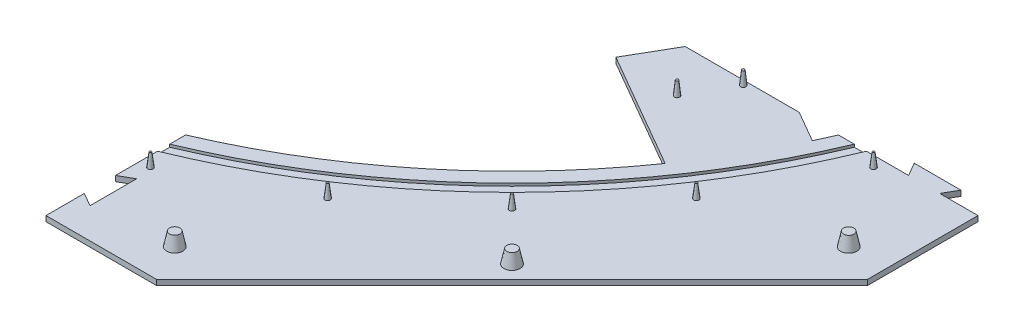
ISO-10303-21;
HEADER;
FILE_DESCRIPTION(('STEP AP214'),'2;1');
FILE_NAME('part.step','',(''),(''),'','','');
FILE_SCHEMA(('AUTOMOTIVE_DESIGN { 1 0 10303 214 1 1 1 1 }'));
ENDSEC;
DATA;
#1=APPLICATION_CONTEXT('core data for automotive mechanical design processes');
#2=APPLICATION_PROTOCOL_DEFINITION('international standard','automotive_design',2000,#1);
#3=PRODUCT_CONTEXT('',#1,'mechanical');
#4=PRODUCT('Part','Part','',(#3));
#5=PRODUCT_RELATED_PRODUCT_CATEGORY('part','',(#4));
#6=PRODUCT_DEFINITION_FORMATION('','',#4);
#7=PRODUCT_DEFINITION_CONTEXT('part definition',#1,'design');
#8=PRODUCT_DEFINITION('design','',#6,#7);
#9=PRODUCT_DEFINITION_SHAPE('','',#8);
#10=(LENGTH_UNIT() NAMED_UNIT(*) SI_UNIT(.MILLI.,.METRE.));
#11=(NAMED_UNIT(*) PLANE_ANGLE_UNIT() SI_UNIT($,.RADIAN.));
#12=(NAMED_UNIT(*) SI_UNIT($,.STERADIAN.) SOLID_ANGLE_UNIT());
#13=UNCERTAINTY_MEASURE_WITH_UNIT(LENGTH_MEASURE(1.E-05),#10,'distance_accuracy_value','');
#14=(GEOMETRIC_REPRESENTATION_CONTEXT(3) GLOBAL_UNCERTAINTY_ASSIGNED_CONTEXT((#13)) GLOBAL_UNIT_ASSIGNED_CONTEXT((#10,
#11,#12)) REPRESENTATION_CONTEXT('',''));
#15=CARTESIAN_POINT('',(0.,0.,0.));
#16=DIRECTION('',(0.,0.,1.));
#17=DIRECTION('',(1.,0.,0.));
#18=AXIS2_PLACEMENT_3D('',#15,#16,#17);
#19=CARTESIAN_POINT('',(0.,0.,0.));
#20=DIRECTION('',(0.,1.,0.));
#21=DIRECTION('',(0.,0.,1.));
#22=AXIS2_PLACEMENT_3D('',#19,#20,#21);
#23=PLANE('',#22);
#24=CARTESIAN_POINT('',(178.571106160672,0.,92.7057713659409));
#25=DIRECTION('',(0.,1.,0.));
#26=DIRECTION('',(-0.866025403784436,0.,-0.500000000000004));
#27=AXIS2_PLACEMENT_3D('',#24,#25,#26);
#28=CIRCLE('',#27,1.);
#29=CARTESIAN_POINT('',(177.705080756887,0.,92.2057713659409));
#30=VERTEX_POINT('',#29);
#31=EDGE_CURVE('E391',#30,#30,#28,.T.);
#32=ORIENTED_EDGE('',*,*,#31,.F.);
#33=EDGE_LOOP('',(#32));
#34=FACE_BOUND('',#33,.T.);
#35=CARTESIAN_POINT('',(169.571106160672,0.,108.294228634061));
#36=DIRECTION('',(0.,1.,0.));
#37=DIRECTION('',(-0.866025403784436,0.,-0.500000000000004));
#38=AXIS2_PLACEMENT_3D('',#35,#36,#37);
#39=CIRCLE('',#38,1.);
#40=CARTESIAN_POINT('',(168.705080756887,0.,107.794228634061));
#41=VERTEX_POINT('',#40);
#42=EDGE_CURVE('E399',#41,#41,#39,.T.);
#43=ORIENTED_EDGE('',*,*,#42,.F.);
#44=EDGE_LOOP('',(#43));
#45=FACE_BOUND('',#44,.T.);
#46=DIRECTION('',(0.,0.,1.));
#47=VECTOR('',#46,1.);
#48=CARTESIAN_POINT('',(91.0000000000001,0.,0.));
#49=LINE('',#48,#47);
#50=CARTESIAN_POINT('',(91.0000000000001,0.,212.176813059297));
#51=VERTEX_POINT('',#50);
#52=CARTESIAN_POINT('',(91.0000000000001,0.,218.074964175166));
#53=VERTEX_POINT('',#52);
#54=EDGE_CURVE('E312',#51,#53,#49,.T.);
#55=ORIENTED_EDGE('',*,*,#54,.T.);
#56=CARTESIAN_POINT('',(0.,0.,0.));
#57=DIRECTION('',(0.,1.,0.));
#58=DIRECTION('',(0.,0.,1.));
#59=AXIS2_PLACEMENT_3D('',#56,#57,#58);
#60=CIRCLE('',#59,236.3);
#61=CARTESIAN_POINT('',(218.074964175166,0.,91.));
#62=VERTEX_POINT('',#61);
#63=EDGE_CURVE('E194',#53,#62,#60,.T.);
#64=ORIENTED_EDGE('',*,*,#63,.T.);
#65=DIRECTION('',(-1.,0.,0.));
#66=VECTOR('',#65,1.);
#67=CARTESIAN_POINT('',(0.,0.,91.));
#68=LINE('',#67,#66);
#69=CARTESIAN_POINT('',(212.176813059297,0.,90.9999999999999));
#70=VERTEX_POINT('',#69);
#71=EDGE_CURVE('E298',#62,#70,#68,.T.);
#72=ORIENTED_EDGE('',*,*,#71,.T.);
#73=CARTESIAN_POINT('',(0.,0.,0.));
#74=DIRECTION('',(0.,1.,0.));
#75=DIRECTION('',(0.86602540378444,0.,0.499999999999998));
#76=AXIS2_PLACEMENT_3D('',#73,#74,#75);
#77=CIRCLE('',#76,230.867927612304);
#78=CARTESIAN_POINT('',(209.185842870421,0.,97.6794919243107));
#79=VERTEX_POINT('',#78);
#80=EDGE_CURVE('E326',#79,#70,#77,.T.);
#81=ORIENTED_EDGE('',*,*,#80,.F.);
#82=DIRECTION('',(-0.86602540378444,0.,-0.499999999999998));
#83=VECTOR('',#82,1.);
#84=CARTESIAN_POINT('',(9.99999999999994,0.,-17.3205080756888));
#85=LINE('',#84,#83);
#86=CARTESIAN_POINT('',(197.616623488769,0.,91.));
#87=VERTEX_POINT('',#86);
#88=EDGE_CURVE('E344',#79,#87,#85,.T.);
#89=ORIENTED_EDGE('',*,*,#88,.T.);
#90=CARTESIAN_POINT('',(155.307222412009,0.,91.));
#91=VERTEX_POINT('',#90);
#92=EDGE_CURVE('E293',#87,#91,#68,.T.);
#93=ORIENTED_EDGE('',*,*,#92,.T.);
#94=DIRECTION('',(-0.499999999999998,0.,0.86602540378444));
#95=VECTOR('',#94,1.);
#96=CARTESIAN_POINT('',(155.884572681199,0.,89.9999999999996));
#97=LINE('',#96,#95);
#98=CARTESIAN_POINT('',(145.884572681199,0.,107.320508075688));
#99=VERTEX_POINT('',#98);
#100=EDGE_CURVE('E341',#91,#99,#97,.T.);
#101=ORIENTED_EDGE('',*,*,#100,.T.);
#102=DIRECTION('',(-0.86602540378444,0.,-0.499999999999998));
#103=VECTOR('',#102,1.);
#104=CARTESIAN_POINT('',(-9.99999999999995,0.,17.3205080756888));
#105=LINE('',#104,#103);
#106=CARTESIAN_POINT('',(189.185842870421,0.,132.320508075688));
#107=VERTEX_POINT('',#106);
#108=EDGE_CURVE('E320',#107,#99,#105,.T.);
#109=ORIENTED_EDGE('',*,*,#108,.F.);
#110=CARTESIAN_POINT('',(0.,0.,0.));
#111=DIRECTION('',(0.,1.,0.));
#112=DIRECTION('',(0.,0.,1.));
#113=AXIS2_PLACEMENT_3D('',#110,#111,#112);
#114=CIRCLE('',#113,230.867927612304);
#115=EDGE_CURVE('E354',#51,#107,#114,.T.);
#116=ORIENTED_EDGE('',*,*,#115,.F.);
#117=EDGE_LOOP('',(#55,#64,#72,#81,#89,#93,#101,#109,#116));
#118=FACE_BOUND('',#117,.T.);
#119=ADVANCED_FACE('F38',(#34,#45,#118),#23,.T.);
#120=CARTESIAN_POINT('',(91.0000000000001,5.,91.));
#121=DIRECTION('',(0.,0.,-1.));
#122=DIRECTION('',(-1.,0.,0.));
#123=AXIS2_PLACEMENT_3D('',#120,#121,#122);
#124=PLANE('',#123);
#125=DIRECTION('',(0.,-1.,0.));
#126=VECTOR('',#125,1.);
#127=CARTESIAN_POINT('',(249.773502691896,5.,91.));
#128=LINE('',#127,#126);
#129=CARTESIAN_POINT('',(249.773502691896,0.,91.));
#130=VERTEX_POINT('',#129);
#131=CARTESIAN_POINT('',(249.773502691896,-2.,91.));
#132=VERTEX_POINT('',#131);
#133=EDGE_CURVE('E62',#130,#132,#128,.T.);
#134=ORIENTED_EDGE('',*,*,#133,.F.);
#135=CARTESIAN_POINT('',(264.,0.,91.));
#136=VERTEX_POINT('',#135);
#137=EDGE_CURVE('E299',#136,#130,#68,.T.);
#138=ORIENTED_EDGE('',*,*,#137,.F.);
#139=DIRECTION('',(0.,1.,0.));
#140=VECTOR('',#139,1.);
#141=CARTESIAN_POINT('',(264.,-2.,91.));
#142=LINE('',#141,#140);
#143=CARTESIAN_POINT('',(264.,-2.,91.));
#144=VERTEX_POINT('',#143);
#145=EDGE_CURVE('E307',#144,#136,#142,.T.);
#146=ORIENTED_EDGE('',*,*,#145,.F.);
#147=DIRECTION('',(1.,0.,0.));
#148=VECTOR('',#147,1.);
#149=CARTESIAN_POINT('',(91.0000000000001,-2.,91.));
#150=LINE('',#149,#148);
#151=EDGE_CURVE('E287',#132,#144,#150,.T.);
#152=ORIENTED_EDGE('',*,*,#151,.F.);
#153=EDGE_LOOP('',(#134,#138,#146,#152));
#154=FACE_BOUND('',#153,.T.);
#155=ADVANCED_FACE('F545',(#154),#124,.T.);
#156=CARTESIAN_POINT('',(91.,5.,290.));
#157=DIRECTION('',(-1.,0.,0.));
#158=DIRECTION('',(0.,0.,1.));
#159=AXIS2_PLACEMENT_3D('',#156,#157,#158);
#160=PLANE('',#159);
#161=DIRECTION('',(0.,1.,0.));
#162=VECTOR('',#161,1.);
#163=CARTESIAN_POINT('',(91.0000000000001,-1.,222.619069264068));
#164=LINE('',#163,#162);
#165=CARTESIAN_POINT('',(91.0000000000001,-1.,222.619069264068));
#166=VERTEX_POINT('',#165);
#167=CARTESIAN_POINT('',(91.0000000000001,0.,222.619069264068));
#168=VERTEX_POINT('',#167);
#169=EDGE_CURVE('E214',#166,#168,#164,.T.);
#170=ORIENTED_EDGE('',*,*,#169,.F.);
#171=DIRECTION('',(0.,0.,-1.));
#172=VECTOR('',#171,1.);
#173=CARTESIAN_POINT('',(91.,-1.,290.));
#174=LINE('',#173,#172);
#175=CARTESIAN_POINT('',(91.0000000000001,-1.,218.074964175166));
#176=VERTEX_POINT('',#175);
#177=EDGE_CURVE('E199',#166,#176,#174,.T.);
#178=ORIENTED_EDGE('',*,*,#177,.T.);
#179=DIRECTION('',(0.,1.,0.));
#180=VECTOR('',#179,1.);
#181=CARTESIAN_POINT('',(91.0000000000001,-1.,218.074964175166));
#182=LINE('',#181,#180);
#183=EDGE_CURVE('E191',#176,#53,#182,.T.);
#184=ORIENTED_EDGE('',*,*,#183,.T.);
#185=ORIENTED_EDGE('',*,*,#54,.F.);
#186=DIRECTION('',(0.,1.,0.));
#187=VECTOR('',#186,1.);
#188=CARTESIAN_POINT('',(91.0000000000001,-2.,212.176813059297));
#189=LINE('',#188,#187);
#190=CARTESIAN_POINT('',(91.0000000000001,-2.,212.176813059297));
#191=VERTEX_POINT('',#190);
#192=EDGE_CURVE('E480',#51,#191,#189,.F.);
#193=ORIENTED_EDGE('',*,*,#192,.T.);
#194=DIRECTION('',(0.,0.,-1.));
#195=VECTOR('',#194,1.);
#196=CARTESIAN_POINT('',(91.,-2.,290.));
#197=LINE('',#196,#195);
#198=CARTESIAN_POINT('',(91.0000000000001,-2.,238.226497308104));
#199=VERTEX_POINT('',#198);
#200=EDGE_CURVE('E279',#199,#191,#197,.T.);
#201=ORIENTED_EDGE('',*,*,#200,.F.);
#202=DIRECTION('',(0.,-1.,0.));
#203=VECTOR('',#202,1.);
#204=CARTESIAN_POINT('',(91.0000000000001,5.,238.226497308104));
#205=LINE('',#204,#203);
#206=CARTESIAN_POINT('',(91.0000000000001,0.,238.226497308104));
#207=VERTEX_POINT('',#206);
#208=EDGE_CURVE('E486',#207,#199,#205,.T.);
#209=ORIENTED_EDGE('',*,*,#208,.F.);
#210=EDGE_CURVE('E316',#168,#207,#49,.T.);
#211=ORIENTED_EDGE('',*,*,#210,.F.);
#212=EDGE_LOOP('',(#170,#178,#184,#185,#193,#201,#209,#211));
#213=FACE_BOUND('',#212,.T.);
#214=ADVANCED_FACE('F212',(#213),#160,.T.);
#215=CARTESIAN_POINT('',(0.,-2.,0.));
#216=DIRECTION('',(0.,1.,0.));
#217=DIRECTION('',(0.,0.,1.));
#218=AXIS2_PLACEMENT_3D('',#215,#216,#217);
#219=PLANE('',#218);
#220=DIRECTION('',(-0.500000000000001,0.,0.866025403784438));
#221=VECTOR('',#220,1.);
#222=CARTESIAN_POINT('',(252.660254037844,-2.,86.));
#223=LINE('',#222,#221);
#224=CARTESIAN_POINT('',(252.660254037844,-2.,86.));
#225=VERTEX_POINT('',#224);
#226=EDGE_CURVE('E224',#225,#132,#223,.T.);
#227=ORIENTED_EDGE('',*,*,#226,.T.);
#228=ORIENTED_EDGE('',*,*,#151,.T.);
#229=DIRECTION('',(0.,0.,-1.));
#230=VECTOR('',#229,1.);
#231=CARTESIAN_POINT('',(264.,-2.,131.979594929244));
#232=LINE('',#231,#230);
#233=CARTESIAN_POINT('',(264.,-2.,131.979594929244));
#234=VERTEX_POINT('',#233);
#235=EDGE_CURVE('E447',#234,#144,#232,.T.);
#236=ORIENTED_EDGE('',*,*,#235,.F.);
#237=DIRECTION('',(0.707105696396142,0.,-0.707107865975289));
#238=VECTOR('',#237,1.);
#239=CARTESIAN_POINT('',(264.,-2.,131.979594929244));
#240=LINE('',#239,#238);
#241=CARTESIAN_POINT('',(131.98,-2.,264.));
#242=VERTEX_POINT('',#241);
#243=EDGE_CURVE('E455',#242,#234,#240,.T.);
#244=ORIENTED_EDGE('',*,*,#243,.F.);
#245=DIRECTION('',(1.,0.,0.));
#246=VECTOR('',#245,1.);
#247=CARTESIAN_POINT('',(-131.979594929244,-2.,264.));
#248=LINE('',#247,#246);
#249=CARTESIAN_POINT('',(91.,-2.,264.));
#250=VERTEX_POINT('',#249);
#251=EDGE_CURVE('E451',#250,#242,#248,.T.);
#252=ORIENTED_EDGE('',*,*,#251,.F.);
#253=CARTESIAN_POINT('',(91.,-2.,249.773502691896));
#254=VERTEX_POINT('',#253);
#255=EDGE_CURVE('E283',#250,#254,#197,.T.);
#256=ORIENTED_EDGE('',*,*,#255,.T.);
#257=DIRECTION('',(0.866025403784439,0.,0.5));
#258=VECTOR('',#257,1.);
#259=CARTESIAN_POINT('',(81.0000000000001,-2.,244.));
#260=LINE('',#259,#258);
#261=CARTESIAN_POINT('',(96.,-2.,252.660254037844));
#262=VERTEX_POINT('',#261);
#263=EDGE_CURVE('E257',#254,#262,#260,.T.);
#264=ORIENTED_EDGE('',*,*,#263,.T.);
#265=DIRECTION('',(0.,0.,-1.));
#266=VECTOR('',#265,1.);
#267=CARTESIAN_POINT('',(96.,-2.,252.660254037844));
#268=LINE('',#267,#266);
#269=CARTESIAN_POINT('',(96.,-2.,235.339745962156));
#270=VERTEX_POINT('',#269);
#271=EDGE_CURVE('E262',#262,#270,#268,.T.);
#272=ORIENTED_EDGE('',*,*,#271,.T.);
#273=DIRECTION('',(-0.866025403784439,0.,0.5));
#274=VECTOR('',#273,1.);
#275=CARTESIAN_POINT('',(96.,-2.,235.339745962156));
#276=LINE('',#275,#274);
#277=EDGE_CURVE('E253',#270,#199,#276,.T.);
#278=ORIENTED_EDGE('',*,*,#277,.T.);
#279=ORIENTED_EDGE('',*,*,#200,.T.);
#280=CARTESIAN_POINT('',(0.,-2.,0.));
#281=DIRECTION('',(0.,1.,0.));
#282=DIRECTION('',(0.,0.,1.));
#283=AXIS2_PLACEMENT_3D('',#280,#281,#282);
#284=CIRCLE('',#283,230.867927612304);
#285=CARTESIAN_POINT('',(189.185842870421,-2.,132.320508075688));
#286=VERTEX_POINT('',#285);
#287=EDGE_CURVE('E362',#191,#286,#284,.T.);
#288=ORIENTED_EDGE('',*,*,#287,.T.);
#289=DIRECTION('',(-0.86602540378444,0.,-0.499999999999998));
#290=VECTOR('',#289,1.);
#291=CARTESIAN_POINT('',(-9.99999999999995,-2.,17.3205080756888));
#292=LINE('',#291,#290);
#293=CARTESIAN_POINT('',(145.884572681199,-2.,107.320508075688));
#294=VERTEX_POINT('',#293);
#295=EDGE_CURVE('E321',#286,#294,#292,.T.);
#296=ORIENTED_EDGE('',*,*,#295,.T.);
#297=DIRECTION('',(-0.499999999999998,0.,0.86602540378444));
#298=VECTOR('',#297,1.);
#299=CARTESIAN_POINT('',(155.884572681199,-2.,89.9999999999996));
#300=LINE('',#299,#298);
#301=CARTESIAN_POINT('',(155.307222412009,-2.,91.));
#302=VERTEX_POINT('',#301);
#303=EDGE_CURVE('E325',#302,#294,#300,.T.);
#304=ORIENTED_EDGE('',*,*,#303,.F.);
#305=CARTESIAN_POINT('',(197.616623488769,-2.,91.));
#306=VERTEX_POINT('',#305);
#307=EDGE_CURVE('E292',#302,#306,#150,.T.);
#308=ORIENTED_EDGE('',*,*,#307,.T.);
#309=DIRECTION('',(-0.86602540378444,0.,-0.499999999999998));
#310=VECTOR('',#309,1.);
#311=CARTESIAN_POINT('',(9.99999999999994,-2.,-17.3205080756888));
#312=LINE('',#311,#310);
#313=CARTESIAN_POINT('',(209.185842870421,-2.,97.6794919243107));
#314=VERTEX_POINT('',#313);
#315=EDGE_CURVE('E329',#314,#306,#312,.T.);
#316=ORIENTED_EDGE('',*,*,#315,.F.);
#317=CARTESIAN_POINT('',(0.,-2.,0.));
#318=DIRECTION('',(0.,1.,0.));
#319=DIRECTION('',(0.86602540378444,0.,0.499999999999998));
#320=AXIS2_PLACEMENT_3D('',#317,#318,#319);
#321=CIRCLE('',#320,230.867927612304);
#322=CARTESIAN_POINT('',(212.176813059297,-2.,91.));
#323=VERTEX_POINT('',#322);
#324=EDGE_CURVE('E333',#314,#323,#321,.T.);
#325=ORIENTED_EDGE('',*,*,#324,.T.);
#326=CARTESIAN_POINT('',(238.226497308104,-2.,91.));
#327=VERTEX_POINT('',#326);
#328=EDGE_CURVE('E288',#323,#327,#150,.T.);
#329=ORIENTED_EDGE('',*,*,#328,.T.);
#330=DIRECTION('',(-0.5,0.,-0.866025403784439));
#331=VECTOR('',#330,1.);
#332=CARTESIAN_POINT('',(244.,-2.,101.));
#333=LINE('',#332,#331);
#334=CARTESIAN_POINT('',(235.339745962156,-2.,86.));
#335=VERTEX_POINT('',#334);
#336=EDGE_CURVE('E220',#327,#335,#333,.T.);
#337=ORIENTED_EDGE('',*,*,#336,.T.);
#338=DIRECTION('',(1.,0.,0.));
#339=VECTOR('',#338,1.);
#340=CARTESIAN_POINT('',(235.339745962156,-2.,86.));
#341=LINE('',#340,#339);
#342=EDGE_CURVE('E229',#335,#225,#341,.T.);
#343=ORIENTED_EDGE('',*,*,#342,.T.);
#344=EDGE_LOOP('',(#227,#228,#236,#244,#252,#256,#264,#272,#278,#279,#288,#296,#304,#308,#316,
#325,#329,#337,#343));
#345=FACE_BOUND('',#344,.T.);
#346=ADVANCED_FACE('F553',(#345),#219,.F.);
#347=CARTESIAN_POINT('',(0.,0.,0.));
#348=DIRECTION('',(0.,1.,0.));
#349=DIRECTION('',(0.,0.,1.));
#350=AXIS2_PLACEMENT_3D('',#347,#348,#349);
#351=CIRCLE('',#350,240.5);
#352=CARTESIAN_POINT('',(222.619069264068,0.,91.));
#353=VERTEX_POINT('',#352);
#354=EDGE_CURVE('E209',#168,#353,#351,.T.);
#355=ORIENTED_EDGE('',*,*,#354,.F.);
#356=ORIENTED_EDGE('',*,*,#210,.T.);
#357=DIRECTION('',(-0.866025403784439,0.,0.5));
#358=VECTOR('',#357,1.);
#359=CARTESIAN_POINT('',(96.,0.,235.339745962156));
#360=LINE('',#359,#358);
#361=CARTESIAN_POINT('',(96.,0.,235.339745962156));
#362=VERTEX_POINT('',#361);
#363=EDGE_CURVE('E252',#362,#207,#360,.T.);
#364=ORIENTED_EDGE('',*,*,#363,.F.);
#365=DIRECTION('',(0.,0.,-1.));
#366=VECTOR('',#365,1.);
#367=CARTESIAN_POINT('',(96.,0.,252.660254037844));
#368=LINE('',#367,#366);
#369=CARTESIAN_POINT('',(96.,0.,252.660254037844));
#370=VERTEX_POINT('',#369);
#371=EDGE_CURVE('E258',#370,#362,#368,.T.);
#372=ORIENTED_EDGE('',*,*,#371,.F.);
#373=DIRECTION('',(0.866025403784439,0.,0.5));
#374=VECTOR('',#373,1.);
#375=CARTESIAN_POINT('',(81.0000000000001,0.,244.));
#376=LINE('',#375,#374);
#377=CARTESIAN_POINT('',(91.,0.,249.773502691896));
#378=VERTEX_POINT('',#377);
#379=EDGE_CURVE('E270',#378,#370,#376,.T.);
#380=ORIENTED_EDGE('',*,*,#379,.F.);
#381=CARTESIAN_POINT('',(91.,0.,264.));
#382=VERTEX_POINT('',#381);
#383=EDGE_CURVE('E311',#378,#382,#49,.T.);
#384=ORIENTED_EDGE('',*,*,#383,.T.);
#385=DIRECTION('',(1.,0.,0.));
#386=VECTOR('',#385,1.);
#387=CARTESIAN_POINT('',(0.,0.,264.));
#388=LINE('',#387,#386);
#389=CARTESIAN_POINT('',(131.98,0.,264.));
#390=VERTEX_POINT('',#389);
#391=EDGE_CURVE('E463',#382,#390,#388,.T.);
#392=ORIENTED_EDGE('',*,*,#391,.T.);
#393=DIRECTION('',(0.707105696396142,0.,-0.707107865975289));
#394=VECTOR('',#393,1.);
#395=CARTESIAN_POINT('',(264.,0.,131.979594929244));
#396=LINE('',#395,#394);
#397=CARTESIAN_POINT('',(264.,0.,131.979594929244));
#398=VERTEX_POINT('',#397);
#399=EDGE_CURVE('E452',#390,#398,#396,.T.);
#400=ORIENTED_EDGE('',*,*,#399,.T.);
#401=DIRECTION('',(0.,0.,-1.));
#402=VECTOR('',#401,1.);
#403=CARTESIAN_POINT('',(264.,0.,0.));
#404=LINE('',#403,#402);
#405=EDGE_CURVE('E446',#398,#136,#404,.T.);
#406=ORIENTED_EDGE('',*,*,#405,.T.);
#407=ORIENTED_EDGE('',*,*,#137,.T.);
#408=DIRECTION('',(-0.500000000000001,0.,0.866025403784438));
#409=VECTOR('',#408,1.);
#410=CARTESIAN_POINT('',(252.660254037844,0.,86.));
#411=LINE('',#410,#409);
#412=CARTESIAN_POINT('',(252.660254037844,0.,86.));
#413=VERTEX_POINT('',#412);
#414=EDGE_CURVE('E243',#413,#130,#411,.T.);
#415=ORIENTED_EDGE('',*,*,#414,.F.);
#416=DIRECTION('',(1.,0.,0.));
#417=VECTOR('',#416,1.);
#418=CARTESIAN_POINT('',(235.339745962156,0.,86.));
#419=LINE('',#418,#417);
#420=CARTESIAN_POINT('',(235.339745962156,0.,86.));
#421=VERTEX_POINT('',#420);
#422=EDGE_CURVE('E228',#421,#413,#419,.T.);
#423=ORIENTED_EDGE('',*,*,#422,.F.);
#424=DIRECTION('',(-0.5,0.,-0.866025403784439));
#425=VECTOR('',#424,1.);
#426=CARTESIAN_POINT('',(244.,0.,101.));
#427=LINE('',#426,#425);
#428=CARTESIAN_POINT('',(238.226497308104,0.,91.));
#429=VERTEX_POINT('',#428);
#430=EDGE_CURVE('E239',#429,#421,#427,.T.);
#431=ORIENTED_EDGE('',*,*,#430,.F.);
#432=EDGE_CURVE('E521',#429,#353,#68,.T.);
#433=ORIENTED_EDGE('',*,*,#432,.T.);
#434=EDGE_LOOP('',(#355,#356,#364,#372,#380,#384,#392,#400,#406,#407,#415,#423,#431,#433));
#435=FACE_BOUND('',#434,.T.);
#436=CARTESIAN_POINT('',(229.122124062799,0.,94.9054912265432));
#437=DIRECTION('',(0.,1.,0.));
#438=DIRECTION('',(-0.923879532511285,0.,-0.382683432365094));
#439=AXIS2_PLACEMENT_3D('',#436,#437,#438);
#440=CIRCLE('',#439,1.);
#441=CARTESIAN_POINT('',(228.198244530287,0.,94.5228077941781));
#442=VERTEX_POINT('',#441);
#443=EDGE_CURVE('E438',#442,#442,#440,.T.);
#444=ORIENTED_EDGE('',*,*,#443,.F.);
#445=EDGE_LOOP('',(#444));
#446=FACE_BOUND('',#445,.T.);
#447=CARTESIAN_POINT('',(206.204463851031,0.,137.781417788862));
#448=DIRECTION('',(0.,1.,0.));
#449=DIRECTION('',(-0.831469612302542,0.,-0.555570233019606));
#450=AXIS2_PLACEMENT_3D('',#447,#448,#449);
#451=CIRCLE('',#450,1.);
#452=CARTESIAN_POINT('',(205.372994238728,0.,137.225847555843));
#453=VERTEX_POINT('',#452);
#454=EDGE_CURVE('E431',#453,#453,#451,.T.);
#455=ORIENTED_EDGE('',*,*,#454,.F.);
#456=EDGE_LOOP('',(#455));
#457=FACE_BOUND('',#456,.T.);
#458=CARTESIAN_POINT('',(175.362481734263,0.,175.362481734265));
#459=DIRECTION('',(0.,1.,0.));
#460=DIRECTION('',(-0.707106781186544,0.,-0.707106781186551));
#461=AXIS2_PLACEMENT_3D('',#458,#459,#460);
#462=CIRCLE('',#461,1.);
#463=CARTESIAN_POINT('',(174.655374953076,0.,174.655374953078));
#464=VERTEX_POINT('',#463);
#465=EDGE_CURVE('E423',#464,#464,#462,.T.);
#466=ORIENTED_EDGE('',*,*,#465,.F.);
#467=EDGE_LOOP('',(#466));
#468=FACE_BOUND('',#467,.T.);
#469=CARTESIAN_POINT('',(137.78141778886,0.,206.204463851032));
#470=DIRECTION('',(0.,1.,0.));
#471=DIRECTION('',(-0.555570233019598,0.,-0.831469612302548));
#472=AXIS2_PLACEMENT_3D('',#469,#470,#471);
#473=CIRCLE('',#472,1.);
#474=CARTESIAN_POINT('',(137.225847555841,0.,205.372994238729));
#475=VERTEX_POINT('',#474);
#476=EDGE_CURVE('E415',#475,#475,#473,.T.);
#477=ORIENTED_EDGE('',*,*,#476,.F.);
#478=EDGE_LOOP('',(#477));
#479=FACE_BOUND('',#478,.T.);
#480=CARTESIAN_POINT('',(94.9054912265409,0.,229.1221240628));
#481=DIRECTION('',(0.,1.,0.));
#482=DIRECTION('',(-0.382683432365084,0.,-0.923879532511289));
#483=AXIS2_PLACEMENT_3D('',#480,#481,#482);
#484=CIRCLE('',#483,1.);
#485=CARTESIAN_POINT('',(94.5228077941759,0.,228.198244530288));
#486=VERTEX_POINT('',#485);
#487=EDGE_CURVE('E407',#486,#486,#484,.T.);
#488=ORIENTED_EDGE('',*,*,#487,.F.);
#489=EDGE_LOOP('',(#488));
#490=FACE_BOUND('',#489,.T.);
#491=CARTESIAN_POINT('',(193.040151263927,0.,193.040151263928));
#492=DIRECTION('',(0.,1.,0.));
#493=DIRECTION('',(0.,0.,-1.));
#494=AXIS2_PLACEMENT_3D('',#491,#492,#493);
#495=CIRCLE('',#494,2.99999999999999);
#496=CARTESIAN_POINT('',(193.040151263927,0.,190.040151263928));
#497=VERTEX_POINT('',#496);
#498=EDGE_CURVE('E383',#497,#497,#495,.T.);
#499=ORIENTED_EDGE('',*,*,#498,.F.);
#500=EDGE_LOOP('',(#499));
#501=FACE_BOUND('',#500,.T.);
#502=CARTESIAN_POINT('',(249.999999999999,0.,125.000000000003));
#503=DIRECTION('',(0.,1.,0.));
#504=DIRECTION('',(1.,0.,0.));
#505=AXIS2_PLACEMENT_3D('',#502,#503,#504);
#506=CIRCLE('',#505,2.99999999999999);
#507=CARTESIAN_POINT('',(252.999999999999,0.,125.000000000003));
#508=VERTEX_POINT('',#507);
#509=EDGE_CURVE('E375',#508,#508,#506,.T.);
#510=ORIENTED_EDGE('',*,*,#509,.F.);
#511=EDGE_LOOP('',(#510));
#512=FACE_BOUND('',#511,.T.);
#513=CARTESIAN_POINT('',(124.868636456034,0.,250.065638642359));
#514=DIRECTION('',(0.,1.,0.));
#515=DIRECTION('',(0.799684658487083,0.,0.600420225325894));
#516=AXIS2_PLACEMENT_3D('',#513,#514,#515);
#517=CIRCLE('',#516,2.99999999999999);
#518=CARTESIAN_POINT('',(127.267690431495,0.,251.866899318336));
#519=VERTEX_POINT('',#518);
#520=EDGE_CURVE('E365',#519,#519,#517,.T.);
#521=ORIENTED_EDGE('',*,*,#520,.F.);
#522=EDGE_LOOP('',(#521));
#523=FACE_BOUND('',#522,.T.);
#524=ADVANCED_FACE('F517',(#435,#446,#457,#468,#479,#490,#501,#512,#523),#23,.T.);
#525=CARTESIAN_POINT('',(0.,-2.,264.));
#526=DIRECTION('',(0.,0.,1.));
#527=DIRECTION('',(1.,0.,0.));
#528=AXIS2_PLACEMENT_3D('',#525,#526,#527);
#529=PLANE('',#528);
#530=ORIENTED_EDGE('',*,*,#391,.F.);
#531=DIRECTION('',(0.,-1.,0.));
#532=VECTOR('',#531,1.);
#533=CARTESIAN_POINT('',(91.,-2.,264.));
#534=LINE('',#533,#532);
#535=EDGE_CURVE('E315',#382,#250,#534,.T.);
#536=ORIENTED_EDGE('',*,*,#535,.T.);
#537=ORIENTED_EDGE('',*,*,#251,.T.);
#538=DIRECTION('',(0.,1.,0.));
#539=VECTOR('',#538,1.);
#540=CARTESIAN_POINT('',(131.98,-2.,264.));
#541=LINE('',#540,#539);
#542=EDGE_CURVE('E459',#242,#390,#541,.T.);
#543=ORIENTED_EDGE('',*,*,#542,.T.);
#544=EDGE_LOOP('',(#530,#536,#537,#543));
#545=FACE_BOUND('',#544,.T.);
#546=ADVANCED_FACE('F536',(#545),#529,.T.);
#547=CARTESIAN_POINT('',(264.,-2.,0.));
#548=DIRECTION('',(1.,0.,0.));
#549=DIRECTION('',(0.,0.,-1.));
#550=AXIS2_PLACEMENT_3D('',#547,#548,#549);
#551=PLANE('',#550);
#552=ORIENTED_EDGE('',*,*,#235,.T.);
#553=ORIENTED_EDGE('',*,*,#145,.T.);
#554=ORIENTED_EDGE('',*,*,#405,.F.);
#555=DIRECTION('',(0.,1.,0.));
#556=VECTOR('',#555,1.);
#557=CARTESIAN_POINT('',(264.,-2.,131.979594929244));
#558=LINE('',#557,#556);
#559=EDGE_CURVE('E469',#234,#398,#558,.T.);
#560=ORIENTED_EDGE('',*,*,#559,.F.);
#561=EDGE_LOOP('',(#552,#553,#554,#560));
#562=FACE_BOUND('',#561,.T.);
#563=ADVANCED_FACE('F40',(#562),#551,.T.);
#564=CARTESIAN_POINT('',(0.,-2.,0.));
#565=DIRECTION('',(0.,1.,0.));
#566=DIRECTION('',(0.,0.,1.));
#567=AXIS2_PLACEMENT_3D('',#564,#565,#566);
#568=CYLINDRICAL_SURFACE('',#567,230.867927612304);
#569=ORIENTED_EDGE('',*,*,#192,.F.);
#570=ORIENTED_EDGE('',*,*,#115,.T.);
#571=DIRECTION('',(0.,1.,0.));
#572=VECTOR('',#571,1.);
#573=CARTESIAN_POINT('',(189.185842870421,-2.,132.320508075688));
#574=LINE('',#573,#572);
#575=EDGE_CURVE('E337',#286,#107,#574,.T.);
#576=ORIENTED_EDGE('',*,*,#575,.F.);
#577=ORIENTED_EDGE('',*,*,#287,.F.);
#578=EDGE_LOOP('',(#569,#570,#576,#577));
#579=FACE_BOUND('',#578,.T.);
#580=ADVANCED_FACE('F586',(#579),#568,.F.);
#581=CARTESIAN_POINT('',(0.,-2.,0.));
#582=DIRECTION('',(0.,1.,0.));
#583=DIRECTION('',(0.,0.,1.));
#584=AXIS2_PLACEMENT_3D('',#581,#582,#583);
#585=CYLINDRICAL_SURFACE('',#584,230.867927612304);
#586=DIRECTION('',(0.,1.,0.));
#587=VECTOR('',#586,1.);
#588=CARTESIAN_POINT('',(212.176813059297,-2.,90.9999999999999));
#589=LINE('',#588,#587);
#590=EDGE_CURVE('E303',#323,#70,#589,.T.);
#591=ORIENTED_EDGE('',*,*,#590,.F.);
#592=ORIENTED_EDGE('',*,*,#324,.F.);
#593=DIRECTION('',(0.,1.,0.));
#594=VECTOR('',#593,1.);
#595=CARTESIAN_POINT('',(209.185842870421,-2.,97.6794919243107));
#596=LINE('',#595,#594);
#597=EDGE_CURVE('E351',#314,#79,#596,.T.);
#598=ORIENTED_EDGE('',*,*,#597,.T.);
#599=ORIENTED_EDGE('',*,*,#80,.T.);
#600=EDGE_LOOP('',(#591,#592,#598,#599));
#601=FACE_BOUND('',#600,.T.);
#602=ADVANCED_FACE('F567',(#601),#585,.F.);
#603=CARTESIAN_POINT('',(9.99999999999994,-2.,-17.3205080756888));
#604=DIRECTION('',(0.499999999999998,0.,-0.86602540378444));
#605=DIRECTION('',(-0.86602540378444,0.,-0.499999999999998));
#606=AXIS2_PLACEMENT_3D('',#603,#604,#605);
#607=PLANE('',#606);
#608=ORIENTED_EDGE('',*,*,#315,.T.);
#609=DIRECTION('',(0.,1.,0.));
#610=VECTOR('',#609,1.);
#611=CARTESIAN_POINT('',(197.616623488769,-2.,91.));
#612=LINE('',#611,#610);
#613=EDGE_CURVE('E297',#306,#87,#612,.T.);
#614=ORIENTED_EDGE('',*,*,#613,.T.);
#615=ORIENTED_EDGE('',*,*,#88,.F.);
#616=ORIENTED_EDGE('',*,*,#597,.F.);
#617=EDGE_LOOP('',(#608,#614,#615,#616));
#618=FACE_BOUND('',#617,.T.);
#619=ADVANCED_FACE('F571',(#618),#607,.T.);
#620=CARTESIAN_POINT('',(155.884572681199,-2.,89.9999999999996));
#621=DIRECTION('',(-0.86602540378444,0.,-0.499999999999998));
#622=DIRECTION('',(-0.499999999999998,0.,0.86602540378444));
#623=AXIS2_PLACEMENT_3D('',#620,#621,#622);
#624=PLANE('',#623);
#625=ORIENTED_EDGE('',*,*,#100,.F.);
#626=DIRECTION('',(0.,-1.,0.));
#627=VECTOR('',#626,1.);
#628=CARTESIAN_POINT('',(155.307222412009,-2.,91.));
#629=LINE('',#628,#627);
#630=EDGE_CURVE('E473',#91,#302,#629,.T.);
#631=ORIENTED_EDGE('',*,*,#630,.T.);
#632=ORIENTED_EDGE('',*,*,#303,.T.);
#633=DIRECTION('',(0.,1.,0.));
#634=VECTOR('',#633,1.);
#635=CARTESIAN_POINT('',(145.884572681199,-2.,107.320508075688));
#636=LINE('',#635,#634);
#637=EDGE_CURVE('E355',#294,#99,#636,.T.);
#638=ORIENTED_EDGE('',*,*,#637,.T.);
#639=EDGE_LOOP('',(#625,#631,#632,#638));
#640=FACE_BOUND('',#639,.T.);
#641=ADVANCED_FACE('F579',(#640),#624,.T.);
#642=CARTESIAN_POINT('',(264.,-2.,131.979594929244));
#643=DIRECTION('',(0.707107865975289,0.,0.707105696396142));
#644=DIRECTION('',(0.707105696396142,0.,-0.707107865975289));
#645=AXIS2_PLACEMENT_3D('',#642,#643,#644);
#646=PLANE('',#645);
#647=ORIENTED_EDGE('',*,*,#399,.F.);
#648=ORIENTED_EDGE('',*,*,#542,.F.);
#649=ORIENTED_EDGE('',*,*,#243,.T.);
#650=ORIENTED_EDGE('',*,*,#559,.T.);
#651=EDGE_LOOP('',(#647,#648,#649,#650));
#652=FACE_BOUND('',#651,.T.);
#653=ADVANCED_FACE('F541',(#652),#646,.T.);
#654=CARTESIAN_POINT('',(229.122124062799,0.,94.9054912265432));
#655=DIRECTION('',(0.,-1.,0.));
#656=DIRECTION('',(-0.923879532511285,0.,-0.382683432365094));
#657=AXIS2_PLACEMENT_3D('',#654,#655,#656);
#658=CONICAL_SURFACE('',#657,1.,0.122173047639603);
#659=CARTESIAN_POINT('',(229.122124062799,5.,94.9054912265432));
#660=DIRECTION('',(0.,1.,0.));
#661=DIRECTION('',(0.,0.,1.));
#662=AXIS2_PLACEMENT_3D('',#659,#660,#661);
#663=CIRCLE('',#662,0.386077195485477);
#664=CARTESIAN_POINT('',(229.122124062799,5.,95.2915684220287));
#665=VERTEX_POINT('',#664);
#666=EDGE_CURVE('E442',#665,#665,#663,.T.);
#667=ORIENTED_EDGE('',*,*,#666,.F.);
#668=EDGE_LOOP('',(#667));
#669=FACE_BOUND('',#668,.T.);
#670=ORIENTED_EDGE('',*,*,#443,.T.);
#671=EDGE_LOOP('',(#670));
#672=FACE_BOUND('',#671,.T.);
#673=ADVANCED_FACE('F627',(#669,#672),#658,.T.);
#674=CARTESIAN_POINT('',(229.122124062799,5.,94.9054912265432));
#675=DIRECTION('',(0.,1.,0.));
#676=DIRECTION('',(-0.923879532511285,0.,-0.382683432365094));
#677=AXIS2_PLACEMENT_3D('',#674,#675,#676);
#678=PLANE('',#677);
#679=ORIENTED_EDGE('',*,*,#666,.T.);
#680=EDGE_LOOP('',(#679));
#681=FACE_BOUND('',#680,.T.);
#682=ADVANCED_FACE('F630',(#681),#678,.T.);
#683=CARTESIAN_POINT('',(206.204463851031,0.,137.781417788862));
#684=DIRECTION('',(0.,-1.,0.));
#685=DIRECTION('',(-0.831469612302542,0.,-0.555570233019606));
#686=AXIS2_PLACEMENT_3D('',#683,#684,#685);
#687=CONICAL_SURFACE('',#686,1.,0.122173047639603);
#688=CARTESIAN_POINT('',(206.204463851031,5.,137.781417788862));
#689=DIRECTION('',(0.,1.,0.));
#690=DIRECTION('',(0.,0.,1.));
#691=AXIS2_PLACEMENT_3D('',#688,#689,#690);
#692=CIRCLE('',#691,0.386077195485477);
#693=CARTESIAN_POINT('',(206.204463851031,5.,138.167494984348));
#694=VERTEX_POINT('',#693);
#695=EDGE_CURVE('E434',#694,#694,#692,.T.);
#696=ORIENTED_EDGE('',*,*,#695,.F.);
#697=EDGE_LOOP('',(#696));
#698=FACE_BOUND('',#697,.T.);
#699=ORIENTED_EDGE('',*,*,#454,.T.);
#700=EDGE_LOOP('',(#699));
#701=FACE_BOUND('',#700,.T.);
#702=ADVANCED_FACE('F634',(#698,#701),#687,.T.);
#703=CARTESIAN_POINT('',(206.204463851031,5.,137.781417788862));
#704=DIRECTION('',(0.,1.,0.));
#705=DIRECTION('',(-0.831469612302542,0.,-0.555570233019606));
#706=AXIS2_PLACEMENT_3D('',#703,#704,#705);
#707=PLANE('',#706);
#708=ORIENTED_EDGE('',*,*,#695,.T.);
#709=EDGE_LOOP('',(#708));
#710=FACE_BOUND('',#709,.T.);
#711=ADVANCED_FACE('F638',(#710),#707,.T.);
#712=CARTESIAN_POINT('',(175.362481734263,0.,175.362481734265));
#713=DIRECTION('',(0.,-1.,0.));
#714=DIRECTION('',(-0.707106781186544,0.,-0.707106781186551));
#715=AXIS2_PLACEMENT_3D('',#712,#713,#714);
#716=CONICAL_SURFACE('',#715,1.,0.122173047639603);
#717=CARTESIAN_POINT('',(175.362481734263,5.,175.362481734265));
#718=DIRECTION('',(0.,1.,0.));
#719=DIRECTION('',(0.,0.,1.));
#720=AXIS2_PLACEMENT_3D('',#717,#718,#719);
#721=CIRCLE('',#720,0.386077195485477);
#722=CARTESIAN_POINT('',(175.362481734263,5.,175.74855892975));
#723=VERTEX_POINT('',#722);
#724=EDGE_CURVE('E427',#723,#723,#721,.T.);
#725=ORIENTED_EDGE('',*,*,#724,.F.);
#726=EDGE_LOOP('',(#725));
#727=FACE_BOUND('',#726,.T.);
#728=ORIENTED_EDGE('',*,*,#465,.T.);
#729=EDGE_LOOP('',(#728));
#730=FACE_BOUND('',#729,.T.);
#731=ADVANCED_FACE('F642',(#727,#730),#716,.T.);
#732=CARTESIAN_POINT('',(175.362481734263,5.,175.362481734265));
#733=DIRECTION('',(0.,1.,0.));
#734=DIRECTION('',(-0.707106781186544,0.,-0.707106781186551));
#735=AXIS2_PLACEMENT_3D('',#732,#733,#734);
#736=PLANE('',#735);
#737=ORIENTED_EDGE('',*,*,#724,.T.);
#738=EDGE_LOOP('',(#737));
#739=FACE_BOUND('',#738,.T.);
#740=ADVANCED_FACE('F646',(#739),#736,.T.);
#741=CARTESIAN_POINT('',(137.78141778886,0.,206.204463851032));
#742=DIRECTION('',(0.,-1.,0.));
#743=DIRECTION('',(-0.555570233019598,0.,-0.831469612302548));
#744=AXIS2_PLACEMENT_3D('',#741,#742,#743);
#745=CONICAL_SURFACE('',#744,1.,0.122173047639603);
#746=CARTESIAN_POINT('',(137.78141778886,5.,206.204463851032));
#747=DIRECTION('',(0.,1.,0.));
#748=DIRECTION('',(0.,0.,1.));
#749=AXIS2_PLACEMENT_3D('',#746,#747,#748);
#750=CIRCLE('',#749,0.386077195485477);
#751=CARTESIAN_POINT('',(137.78141778886,5.,206.590541046517));
#752=VERTEX_POINT('',#751);
#753=EDGE_CURVE('E419',#752,#752,#750,.T.);
#754=ORIENTED_EDGE('',*,*,#753,.F.);
#755=EDGE_LOOP('',(#754));
#756=FACE_BOUND('',#755,.T.);
#757=ORIENTED_EDGE('',*,*,#476,.T.);
#758=EDGE_LOOP('',(#757));
#759=FACE_BOUND('',#758,.T.);
#760=ADVANCED_FACE('F650',(#756,#759),#745,.T.);
#761=CARTESIAN_POINT('',(137.78141778886,5.,206.204463851032));
#762=DIRECTION('',(0.,1.,0.));
#763=DIRECTION('',(-0.555570233019598,0.,-0.831469612302548));
#764=AXIS2_PLACEMENT_3D('',#761,#762,#763);
#765=PLANE('',#764);
#766=ORIENTED_EDGE('',*,*,#753,.T.);
#767=EDGE_LOOP('',(#766));
#768=FACE_BOUND('',#767,.T.);
#769=ADVANCED_FACE('F654',(#768),#765,.T.);
#770=CARTESIAN_POINT('',(94.9054912265409,0.,229.1221240628));
#771=DIRECTION('',(0.,-1.,0.));
#772=DIRECTION('',(-0.382683432365084,0.,-0.923879532511289));
#773=AXIS2_PLACEMENT_3D('',#770,#771,#772);
#774=CONICAL_SURFACE('',#773,1.,0.122173047639603);
#775=CARTESIAN_POINT('',(94.9054912265409,5.,229.1221240628));
#776=DIRECTION('',(0.,1.,0.));
#777=DIRECTION('',(0.,0.,1.));
#778=AXIS2_PLACEMENT_3D('',#775,#776,#777);
#779=CIRCLE('',#778,0.386077195485477);
#780=CARTESIAN_POINT('',(94.9054912265409,5.,229.508201258285));
#781=VERTEX_POINT('',#780);
#782=EDGE_CURVE('E411',#781,#781,#779,.T.);
#783=ORIENTED_EDGE('',*,*,#782,.F.);
#784=EDGE_LOOP('',(#783));
#785=FACE_BOUND('',#784,.T.);
#786=ORIENTED_EDGE('',*,*,#487,.T.);
#787=EDGE_LOOP('',(#786));
#788=FACE_BOUND('',#787,.T.);
#789=ADVANCED_FACE('F658',(#785,#788),#774,.T.);
#790=CARTESIAN_POINT('',(94.9054912265409,5.,229.1221240628));
#791=DIRECTION('',(0.,1.,0.));
#792=DIRECTION('',(-0.382683432365084,0.,-0.923879532511289));
#793=AXIS2_PLACEMENT_3D('',#790,#791,#792);
#794=PLANE('',#793);
#795=ORIENTED_EDGE('',*,*,#782,.T.);
#796=EDGE_LOOP('',(#795));
#797=FACE_BOUND('',#796,.T.);
#798=ADVANCED_FACE('F662',(#797),#794,.T.);
#799=CARTESIAN_POINT('',(169.571106160672,0.,108.294228634061));
#800=DIRECTION('',(0.,-1.,0.));
#801=DIRECTION('',(-0.866025403784436,0.,-0.500000000000004));
#802=AXIS2_PLACEMENT_3D('',#799,#800,#801);
#803=CONICAL_SURFACE('',#802,1.,0.10471975511966);
#804=CARTESIAN_POINT('',(169.571106160672,5.,108.294228634061));
#805=DIRECTION('',(0.,1.,0.));
#806=DIRECTION('',(0.,0.,1.));
#807=AXIS2_PLACEMENT_3D('',#804,#805,#806);
#808=CIRCLE('',#807,0.474478823671619);
#809=CARTESIAN_POINT('',(169.571106160672,5.,108.768707457732));
#810=VERTEX_POINT('',#809);
#811=EDGE_CURVE('E403',#810,#810,#808,.T.);
#812=ORIENTED_EDGE('',*,*,#811,.F.);
#813=EDGE_LOOP('',(#812));
#814=FACE_BOUND('',#813,.T.);
#815=ORIENTED_EDGE('',*,*,#42,.T.);
#816=EDGE_LOOP('',(#815));
#817=FACE_BOUND('',#816,.T.);
#818=ADVANCED_FACE('F666',(#814,#817),#803,.T.);
#819=CARTESIAN_POINT('',(169.571106160672,5.,108.294228634061));
#820=DIRECTION('',(0.,1.,0.));
#821=DIRECTION('',(-0.866025403784436,0.,-0.500000000000004));
#822=AXIS2_PLACEMENT_3D('',#819,#820,#821);
#823=PLANE('',#822);
#824=ORIENTED_EDGE('',*,*,#811,.T.);
#825=EDGE_LOOP('',(#824));
#826=FACE_BOUND('',#825,.T.);
#827=ADVANCED_FACE('F670',(#826),#823,.T.);
#828=CARTESIAN_POINT('',(178.571106160672,0.,92.7057713659409));
#829=DIRECTION('',(0.,-1.,0.));
#830=DIRECTION('',(-0.866025403784436,0.,-0.500000000000004));
#831=AXIS2_PLACEMENT_3D('',#828,#829,#830);
#832=CONICAL_SURFACE('',#831,1.,0.10471975511966);
#833=CARTESIAN_POINT('',(178.571106160672,5.,92.7057713659409));
#834=DIRECTION('',(0.,1.,0.));
#835=DIRECTION('',(0.,0.,1.));
#836=AXIS2_PLACEMENT_3D('',#833,#834,#835);
#837=CIRCLE('',#836,0.474478823671619);
#838=CARTESIAN_POINT('',(178.571106160672,5.,93.1802501896125));
#839=VERTEX_POINT('',#838);
#840=EDGE_CURVE('E395',#839,#839,#837,.T.);
#841=ORIENTED_EDGE('',*,*,#840,.F.);
#842=EDGE_LOOP('',(#841));
#843=FACE_BOUND('',#842,.T.);
#844=ORIENTED_EDGE('',*,*,#31,.T.);
#845=EDGE_LOOP('',(#844));
#846=FACE_BOUND('',#845,.T.);
#847=ADVANCED_FACE('F674',(#843,#846),#832,.T.);
#848=CARTESIAN_POINT('',(178.571106160672,5.,92.7057713659409));
#849=DIRECTION('',(0.,1.,0.));
#850=DIRECTION('',(-0.866025403784436,0.,-0.500000000000004));
#851=AXIS2_PLACEMENT_3D('',#848,#849,#850);
#852=PLANE('',#851);
#853=ORIENTED_EDGE('',*,*,#840,.T.);
#854=EDGE_LOOP('',(#853));
#855=FACE_BOUND('',#854,.T.);
#856=ADVANCED_FACE('F678',(#855),#852,.T.);
#857=CARTESIAN_POINT('',(193.040151263927,0.,193.040151263928));
#858=DIRECTION('',(0.,-1.,0.));
#859=DIRECTION('',(0.,0.,-1.));
#860=AXIS2_PLACEMENT_3D('',#857,#858,#859);
#861=CONICAL_SURFACE('',#860,2.99999999999999,0.20943951023932);
#862=CARTESIAN_POINT('',(193.040151263927,5.,193.040151263928));
#863=DIRECTION('',(0.,1.,0.));
#864=DIRECTION('',(0.,0.,1.));
#865=AXIS2_PLACEMENT_3D('',#862,#863,#864);
#866=CIRCLE('',#865,1.93721719164988);
#867=CARTESIAN_POINT('',(193.040151263927,5.,194.977368455578));
#868=VERTEX_POINT('',#867);
#869=EDGE_CURVE('E387',#868,#868,#866,.T.);
#870=ORIENTED_EDGE('',*,*,#869,.F.);
#871=EDGE_LOOP('',(#870));
#872=FACE_BOUND('',#871,.T.);
#873=ORIENTED_EDGE('',*,*,#498,.T.);
#874=EDGE_LOOP('',(#873));
#875=FACE_BOUND('',#874,.T.);
#876=ADVANCED_FACE('F682',(#872,#875),#861,.T.);
#877=CARTESIAN_POINT('',(193.040151263927,5.,193.040151263928));
#878=DIRECTION('',(0.,1.,0.));
#879=DIRECTION('',(0.,0.,-1.));
#880=AXIS2_PLACEMENT_3D('',#877,#878,#879);
#881=PLANE('',#880);
#882=ORIENTED_EDGE('',*,*,#869,.T.);
#883=EDGE_LOOP('',(#882));
#884=FACE_BOUND('',#883,.T.);
#885=ADVANCED_FACE('F686',(#884),#881,.T.);
#886=CARTESIAN_POINT('',(249.999999999999,0.,125.000000000003));
#887=DIRECTION('',(0.,-1.,0.));
#888=DIRECTION('',(1.,0.,0.));
#889=AXIS2_PLACEMENT_3D('',#886,#887,#888);
#890=CONICAL_SURFACE('',#889,2.99999999999999,0.20943951023932);
#891=CARTESIAN_POINT('',(249.999999999999,5.,125.000000000003));
#892=DIRECTION('',(0.,1.,0.));
#893=DIRECTION('',(0.,0.,1.));
#894=AXIS2_PLACEMENT_3D('',#891,#892,#893);
#895=CIRCLE('',#894,1.93721719164988);
#896=CARTESIAN_POINT('',(249.999999999999,5.,126.937217191652));
#897=VERTEX_POINT('',#896);
#898=EDGE_CURVE('E379',#897,#897,#895,.T.);
#899=ORIENTED_EDGE('',*,*,#898,.F.);
#900=EDGE_LOOP('',(#899));
#901=FACE_BOUND('',#900,.T.);
#902=ORIENTED_EDGE('',*,*,#509,.T.);
#903=EDGE_LOOP('',(#902));
#904=FACE_BOUND('',#903,.T.);
#905=ADVANCED_FACE('F690',(#901,#904),#890,.T.);
#906=CARTESIAN_POINT('',(249.999999999999,5.,125.000000000003));
#907=DIRECTION('',(0.,1.,0.));
#908=DIRECTION('',(1.,0.,0.));
#909=AXIS2_PLACEMENT_3D('',#906,#907,#908);
#910=PLANE('',#909);
#911=ORIENTED_EDGE('',*,*,#898,.T.);
#912=EDGE_LOOP('',(#911));
#913=FACE_BOUND('',#912,.T.);
#914=ADVANCED_FACE('F694',(#913),#910,.T.);
#915=CARTESIAN_POINT('',(124.868636456034,0.,250.065638642359));
#916=DIRECTION('',(0.,-1.,0.));
#917=DIRECTION('',(0.799684658487083,0.,0.600420225325894));
#918=AXIS2_PLACEMENT_3D('',#915,#916,#917);
#919=CONICAL_SURFACE('',#918,2.99999999999999,0.20943951023932);
#920=CARTESIAN_POINT('',(124.868636456034,5.,250.065638642359));
#921=DIRECTION('',(0.,1.,0.));
#922=DIRECTION('',(0.,0.,1.));
#923=AXIS2_PLACEMENT_3D('',#920,#921,#922);
#924=CIRCLE('',#923,1.93721719164988);
#925=CARTESIAN_POINT('',(124.868636456034,5.,252.002855834009));
#926=VERTEX_POINT('',#925);
#927=EDGE_CURVE('E371',#926,#926,#924,.T.);
#928=ORIENTED_EDGE('',*,*,#927,.F.);
#929=EDGE_LOOP('',(#928));
#930=FACE_BOUND('',#929,.T.);
#931=ORIENTED_EDGE('',*,*,#520,.T.);
#932=EDGE_LOOP('',(#931));
#933=FACE_BOUND('',#932,.T.);
#934=ADVANCED_FACE('F698',(#930,#933),#919,.T.);
#935=CARTESIAN_POINT('',(124.868636456034,5.,250.065638642359));
#936=DIRECTION('',(0.,1.,0.));
#937=DIRECTION('',(0.799684658487083,0.,0.600420225325894));
#938=AXIS2_PLACEMENT_3D('',#935,#936,#937);
#939=PLANE('',#938);
#940=ORIENTED_EDGE('',*,*,#927,.T.);
#941=EDGE_LOOP('',(#940));
#942=FACE_BOUND('',#941,.T.);
#943=ADVANCED_FACE('F702',(#942),#939,.T.);
#944=CARTESIAN_POINT('',(-9.99999999999995,-2.,17.3205080756888));
#945=DIRECTION('',(0.499999999999998,0.,-0.86602540378444));
#946=DIRECTION('',(-0.86602540378444,0.,-0.499999999999998));
#947=AXIS2_PLACEMENT_3D('',#944,#945,#946);
#948=PLANE('',#947);
#949=ORIENTED_EDGE('',*,*,#108,.T.);
#950=ORIENTED_EDGE('',*,*,#637,.F.);
#951=ORIENTED_EDGE('',*,*,#295,.F.);
#952=ORIENTED_EDGE('',*,*,#575,.T.);
#953=EDGE_LOOP('',(#949,#950,#951,#952));
#954=FACE_BOUND('',#953,.T.);
#955=ADVANCED_FACE('F581',(#954),#948,.F.);
#956=ORIENTED_EDGE('',*,*,#307,.F.);
#957=ORIENTED_EDGE('',*,*,#630,.F.);
#958=ORIENTED_EDGE('',*,*,#92,.F.);
#959=ORIENTED_EDGE('',*,*,#613,.F.);
#960=EDGE_LOOP('',(#956,#957,#958,#959));
#961=FACE_BOUND('',#960,.T.);
#962=ADVANCED_FACE('F573',(#961),#124,.T.);
#963=DIRECTION('',(0.,1.,0.));
#964=VECTOR('',#963,1.);
#965=CARTESIAN_POINT('',(222.619069264068,-1.,90.9999999999999));
#966=LINE('',#965,#964);
#967=CARTESIAN_POINT('',(222.619069264068,-1.,91.));
#968=VERTEX_POINT('',#967);
#969=EDGE_CURVE('E11',#353,#968,#966,.F.);
#970=ORIENTED_EDGE('',*,*,#969,.F.);
#971=ORIENTED_EDGE('',*,*,#432,.F.);
#972=DIRECTION('',(0.,1.,0.));
#973=VECTOR('',#972,1.);
#974=CARTESIAN_POINT('',(238.226497308104,5.,91.));
#975=LINE('',#974,#973);
#976=EDGE_CURVE('E489',#327,#429,#975,.T.);
#977=ORIENTED_EDGE('',*,*,#976,.F.);
#978=ORIENTED_EDGE('',*,*,#328,.F.);
#979=ORIENTED_EDGE('',*,*,#590,.T.);
#980=ORIENTED_EDGE('',*,*,#71,.F.);
#981=DIRECTION('',(0.,1.,0.));
#982=VECTOR('',#981,1.);
#983=CARTESIAN_POINT('',(218.074964175166,-1.,90.9999999999999));
#984=LINE('',#983,#982);
#985=CARTESIAN_POINT('',(218.074964175166,-1.,90.9999999999999));
#986=VERTEX_POINT('',#985);
#987=EDGE_CURVE('E495',#62,#986,#984,.F.);
#988=ORIENTED_EDGE('',*,*,#987,.T.);
#989=DIRECTION('',(1.,0.,0.));
#990=VECTOR('',#989,1.);
#991=CARTESIAN_POINT('',(91.0000000000001,-1.,91.));
#992=LINE('',#991,#990);
#993=EDGE_CURVE('E47',#986,#968,#992,.T.);
#994=ORIENTED_EDGE('',*,*,#993,.T.);
#995=EDGE_LOOP('',(#970,#971,#977,#978,#979,#980,#988,#994));
#996=FACE_BOUND('',#995,.T.);
#997=ADVANCED_FACE('F500',(#996),#124,.T.);
#998=DIRECTION('',(0.,1.,0.));
#999=VECTOR('',#998,1.);
#1000=CARTESIAN_POINT('',(91.,5.,249.773502691896));
#1001=LINE('',#1000,#999);
#1002=EDGE_CURVE('E484',#254,#378,#1001,.T.);
#1003=ORIENTED_EDGE('',*,*,#1002,.F.);
#1004=ORIENTED_EDGE('',*,*,#255,.F.);
#1005=ORIENTED_EDGE('',*,*,#535,.F.);
#1006=ORIENTED_EDGE('',*,*,#383,.F.);
#1007=EDGE_LOOP('',(#1003,#1004,#1005,#1006));
#1008=FACE_BOUND('',#1007,.T.);
#1009=ADVANCED_FACE('F533',(#1008),#160,.T.);
#1010=CARTESIAN_POINT('',(96.,-2.,235.339745962156));
#1011=DIRECTION('',(-0.5,0.,-0.866025403784439));
#1012=DIRECTION('',(-0.866025403784439,0.,0.5));
#1013=AXIS2_PLACEMENT_3D('',#1010,#1011,#1012);
#1014=PLANE('',#1013);
#1015=ORIENTED_EDGE('',*,*,#208,.T.);
#1016=ORIENTED_EDGE('',*,*,#277,.F.);
#1017=DIRECTION('',(0.,1.,0.));
#1018=VECTOR('',#1017,1.);
#1019=CARTESIAN_POINT('',(96.,-2.,235.339745962156));
#1020=LINE('',#1019,#1018);
#1021=EDGE_CURVE('E276',#270,#362,#1020,.T.);
#1022=ORIENTED_EDGE('',*,*,#1021,.T.);
#1023=ORIENTED_EDGE('',*,*,#363,.T.);
#1024=EDGE_LOOP('',(#1015,#1016,#1022,#1023));
#1025=FACE_BOUND('',#1024,.T.);
#1026=ADVANCED_FACE('F592',(#1025),#1014,.F.);
#1027=CARTESIAN_POINT('',(96.,-2.,252.660254037844));
#1028=DIRECTION('',(1.,0.,0.));
#1029=DIRECTION('',(0.,0.,-1.));
#1030=AXIS2_PLACEMENT_3D('',#1027,#1028,#1029);
#1031=PLANE('',#1030);
#1032=ORIENTED_EDGE('',*,*,#371,.T.);
#1033=ORIENTED_EDGE('',*,*,#1021,.F.);
#1034=ORIENTED_EDGE('',*,*,#271,.F.);
#1035=DIRECTION('',(0.,1.,0.));
#1036=VECTOR('',#1035,1.);
#1037=CARTESIAN_POINT('',(96.,-2.,252.660254037844));
#1038=LINE('',#1037,#1036);
#1039=EDGE_CURVE('E266',#262,#370,#1038,.T.);
#1040=ORIENTED_EDGE('',*,*,#1039,.T.);
#1041=EDGE_LOOP('',(#1032,#1033,#1034,#1040));
#1042=FACE_BOUND('',#1041,.T.);
#1043=ADVANCED_FACE('F594',(#1042),#1031,.F.);
#1044=CARTESIAN_POINT('',(81.0000000000001,-2.,244.));
#1045=DIRECTION('',(-0.5,0.,0.866025403784439));
#1046=DIRECTION('',(0.866025403784439,0.,0.5));
#1047=AXIS2_PLACEMENT_3D('',#1044,#1045,#1046);
#1048=PLANE('',#1047);
#1049=ORIENTED_EDGE('',*,*,#1002,.T.);
#1050=ORIENTED_EDGE('',*,*,#379,.T.);
#1051=ORIENTED_EDGE('',*,*,#1039,.F.);
#1052=ORIENTED_EDGE('',*,*,#263,.F.);
#1053=EDGE_LOOP('',(#1049,#1050,#1051,#1052));
#1054=FACE_BOUND('',#1053,.T.);
#1055=ADVANCED_FACE('F596',(#1054),#1048,.F.);
#1056=CARTESIAN_POINT('',(235.339745962156,22.9128784747792,86.));
#1057=DIRECTION('',(0.,0.,-1.));
#1058=DIRECTION('',(-1.,0.,0.));
#1059=AXIS2_PLACEMENT_3D('',#1056,#1057,#1058);
#1060=PLANE('',#1059);
#1061=DIRECTION('',(0.,-1.,0.));
#1062=VECTOR('',#1061,1.);
#1063=CARTESIAN_POINT('',(235.339745962156,22.9128784747792,86.));
#1064=LINE('',#1063,#1062);
#1065=EDGE_CURVE('E242',#421,#335,#1064,.T.);
#1066=ORIENTED_EDGE('',*,*,#1065,.F.);
#1067=ORIENTED_EDGE('',*,*,#422,.T.);
#1068=DIRECTION('',(0.,-1.,0.));
#1069=VECTOR('',#1068,1.);
#1070=CARTESIAN_POINT('',(252.660254037844,22.9128784747792,86.));
#1071=LINE('',#1070,#1069);
#1072=EDGE_CURVE('E238',#413,#225,#1071,.T.);
#1073=ORIENTED_EDGE('',*,*,#1072,.T.);
#1074=ORIENTED_EDGE('',*,*,#342,.F.);
#1075=EDGE_LOOP('',(#1066,#1067,#1073,#1074));
#1076=FACE_BOUND('',#1075,.T.);
#1077=ADVANCED_FACE('F558',(#1076),#1060,.T.);
#1078=CARTESIAN_POINT('',(252.660254037844,22.9128784747792,86.));
#1079=DIRECTION('',(0.866025403784438,0.,0.500000000000001));
#1080=DIRECTION('',(0.500000000000001,0.,-0.866025403784438));
#1081=AXIS2_PLACEMENT_3D('',#1078,#1079,#1080);
#1082=PLANE('',#1081);
#1083=ORIENTED_EDGE('',*,*,#414,.T.);
#1084=ORIENTED_EDGE('',*,*,#133,.T.);
#1085=ORIENTED_EDGE('',*,*,#226,.F.);
#1086=ORIENTED_EDGE('',*,*,#1072,.F.);
#1087=EDGE_LOOP('',(#1083,#1084,#1085,#1086));
#1088=FACE_BOUND('',#1087,.T.);
#1089=ADVANCED_FACE('F551',(#1088),#1082,.T.);
#1090=CARTESIAN_POINT('',(244.,22.9128784747792,101.));
#1091=DIRECTION('',(-0.866025403784439,0.,0.5));
#1092=DIRECTION('',(0.5,0.,0.866025403784439));
#1093=AXIS2_PLACEMENT_3D('',#1090,#1091,#1092);
#1094=PLANE('',#1093);
#1095=ORIENTED_EDGE('',*,*,#336,.F.);
#1096=ORIENTED_EDGE('',*,*,#976,.T.);
#1097=ORIENTED_EDGE('',*,*,#430,.T.);
#1098=ORIENTED_EDGE('',*,*,#1065,.T.);
#1099=EDGE_LOOP('',(#1095,#1096,#1097,#1098));
#1100=FACE_BOUND('',#1099,.T.);
#1101=ADVANCED_FACE('F561',(#1100),#1094,.T.);
#1102=CARTESIAN_POINT('',(0.,-1.,0.));
#1103=DIRECTION('',(0.,1.,0.));
#1104=DIRECTION('',(0.,0.,1.));
#1105=AXIS2_PLACEMENT_3D('',#1102,#1103,#1104);
#1106=CYLINDRICAL_SURFACE('',#1105,240.5);
#1107=ORIENTED_EDGE('',*,*,#169,.T.);
#1108=ORIENTED_EDGE('',*,*,#354,.T.);
#1109=ORIENTED_EDGE('',*,*,#969,.T.);
#1110=CARTESIAN_POINT('',(0.,-1.,0.));
#1111=DIRECTION('',(0.,1.,0.));
#1112=DIRECTION('',(0.,0.,1.));
#1113=AXIS2_PLACEMENT_3D('',#1110,#1111,#1112);
#1114=CIRCLE('',#1113,240.5);
#1115=EDGE_CURVE('E200',#166,#968,#1114,.T.);
#1116=ORIENTED_EDGE('',*,*,#1115,.F.);
#1117=EDGE_LOOP('',(#1107,#1108,#1109,#1116));
#1118=FACE_BOUND('',#1117,.T.);
#1119=ADVANCED_FACE('F515',(#1118),#1106,.F.);
#1120=CARTESIAN_POINT('',(0.,-1.,0.));
#1121=DIRECTION('',(0.,1.,0.));
#1122=DIRECTION('',(0.,0.,1.));
#1123=AXIS2_PLACEMENT_3D('',#1120,#1121,#1122);
#1124=PLANE('',#1123);
#1125=ORIENTED_EDGE('',*,*,#1115,.T.);
#1126=ORIENTED_EDGE('',*,*,#993,.F.);
#1127=CARTESIAN_POINT('',(0.,-1.,0.));
#1128=DIRECTION('',(0.,1.,0.));
#1129=DIRECTION('',(0.,0.,1.));
#1130=AXIS2_PLACEMENT_3D('',#1127,#1128,#1129);
#1131=CIRCLE('',#1130,236.3);
#1132=EDGE_CURVE('E54',#176,#986,#1131,.T.);
#1133=ORIENTED_EDGE('',*,*,#1132,.F.);
#1134=ORIENTED_EDGE('',*,*,#177,.F.);
#1135=EDGE_LOOP('',(#1125,#1126,#1133,#1134));
#1136=FACE_BOUND('',#1135,.T.);
#1137=ADVANCED_FACE('F204',(#1136),#1124,.T.);
#1138=CARTESIAN_POINT('',(0.,-1.,0.));
#1139=DIRECTION('',(0.,1.,0.));
#1140=DIRECTION('',(0.,0.,1.));
#1141=AXIS2_PLACEMENT_3D('',#1138,#1139,#1140);
#1142=CYLINDRICAL_SURFACE('',#1141,236.3);
#1143=ORIENTED_EDGE('',*,*,#1132,.T.);
#1144=ORIENTED_EDGE('',*,*,#987,.F.);
#1145=ORIENTED_EDGE('',*,*,#63,.F.);
#1146=ORIENTED_EDGE('',*,*,#183,.F.);
#1147=EDGE_LOOP('',(#1143,#1144,#1145,#1146));
#1148=FACE_BOUND('',#1147,.T.);
#1149=ADVANCED_FACE('F192',(#1148),#1142,.T.);
#1150=CLOSED_SHELL('',(#119,#155,#214,#346,#524,#546,#563,#580,#602,#619,#641,#653,#673,#682,
#702,#711,#731,#740,#760,#769,#789,#798,#818,#827,#847,#856,#876,#885,#905,#914,#934,#943,#955,
#962,#997,#1009,#1026,#1043,#1055,#1077,#1089,#1101,#1119,#1137,#1149));
#1151=MANIFOLD_SOLID_BREP('B2',#1150);
#1152=ADVANCED_BREP_SHAPE_REPRESENTATION('',(#18,#1151),#14);
#1153=SHAPE_DEFINITION_REPRESENTATION(#9,#1152);
ENDSEC;
END-ISO-10303-21;
